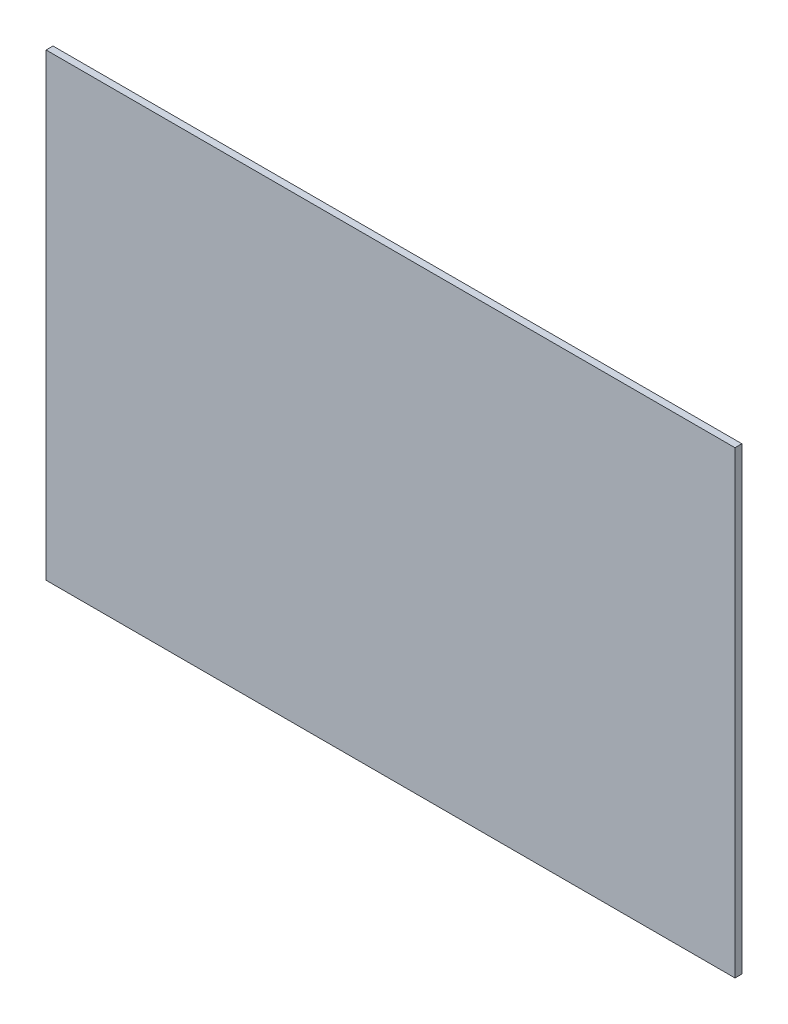
ISO-10303-21;
HEADER;
FILE_DESCRIPTION(('STEP AP214'),'2;1');
FILE_NAME('part.step','',(''),(''),'','','');
FILE_SCHEMA(('AUTOMOTIVE_DESIGN { 1 0 10303 214 1 1 1 1 }'));
ENDSEC;
DATA;
#1=APPLICATION_CONTEXT('core data for automotive mechanical design processes');
#2=APPLICATION_PROTOCOL_DEFINITION('international standard','automotive_design',2000,#1);
#3=PRODUCT_CONTEXT('',#1,'mechanical');
#4=PRODUCT('Part','Part','',(#3));
#5=PRODUCT_RELATED_PRODUCT_CATEGORY('part','',(#4));
#6=PRODUCT_DEFINITION_FORMATION('','',#4);
#7=PRODUCT_DEFINITION_CONTEXT('part definition',#1,'design');
#8=PRODUCT_DEFINITION('design','',#6,#7);
#9=PRODUCT_DEFINITION_SHAPE('','',#8);
#10=(LENGTH_UNIT() NAMED_UNIT(*) SI_UNIT(.MILLI.,.METRE.));
#11=(NAMED_UNIT(*) PLANE_ANGLE_UNIT() SI_UNIT($,.RADIAN.));
#12=(NAMED_UNIT(*) SI_UNIT($,.STERADIAN.) SOLID_ANGLE_UNIT());
#13=UNCERTAINTY_MEASURE_WITH_UNIT(LENGTH_MEASURE(1.E-05),#10,'distance_accuracy_value','');
#14=(GEOMETRIC_REPRESENTATION_CONTEXT(3) GLOBAL_UNCERTAINTY_ASSIGNED_CONTEXT((#13)) GLOBAL_UNIT_ASSIGNED_CONTEXT((#10,
#11,#12)) REPRESENTATION_CONTEXT('',''));
#15=CARTESIAN_POINT('',(0.,0.,0.));
#16=DIRECTION('',(0.,0.,1.));
#17=DIRECTION('',(1.,0.,0.));
#18=AXIS2_PLACEMENT_3D('',#15,#16,#17);
#19=CARTESIAN_POINT('',(-150.,-100.,3.));
#20=DIRECTION('',(1.,0.,0.));
#21=DIRECTION('',(0.,0.,-1.));
#22=AXIS2_PLACEMENT_3D('',#19,#20,#21);
#23=PLANE('',#22);
#24=DIRECTION('',(0.,-1.,0.));
#25=VECTOR('',#24,1.);
#26=CARTESIAN_POINT('',(-150.,-100.,0.));
#27=LINE('',#26,#25);
#28=CARTESIAN_POINT('',(-150.,100.,0.));
#29=VERTEX_POINT('',#28);
#30=CARTESIAN_POINT('',(-150.,-100.,0.));
#31=VERTEX_POINT('',#30);
#32=EDGE_CURVE('E102',#29,#31,#27,.T.);
#33=ORIENTED_EDGE('',*,*,#32,.T.);
#34=DIRECTION('',(0.,0.,-1.));
#35=VECTOR('',#34,1.);
#36=CARTESIAN_POINT('',(-150.,-100.,3.));
#37=LINE('',#36,#35);
#38=CARTESIAN_POINT('',(-150.,-100.,3.));
#39=VERTEX_POINT('',#38);
#40=EDGE_CURVE('E11',#39,#31,#37,.T.);
#41=ORIENTED_EDGE('',*,*,#40,.F.);
#42=DIRECTION('',(0.,-1.,0.));
#43=VECTOR('',#42,1.);
#44=CARTESIAN_POINT('',(-150.,-100.,3.));
#45=LINE('',#44,#43);
#46=CARTESIAN_POINT('',(-150.,100.,3.));
#47=VERTEX_POINT('',#46);
#48=EDGE_CURVE('E90',#47,#39,#45,.T.);
#49=ORIENTED_EDGE('',*,*,#48,.F.);
#50=DIRECTION('',(0.,0.,-1.));
#51=VECTOR('',#50,1.);
#52=CARTESIAN_POINT('',(-150.,100.,3.));
#53=LINE('',#52,#51);
#54=EDGE_CURVE('E98',#47,#29,#53,.T.);
#55=ORIENTED_EDGE('',*,*,#54,.T.);
#56=EDGE_LOOP('',(#33,#41,#49,#55));
#57=FACE_BOUND('',#56,.T.);
#58=ADVANCED_FACE('F39',(#57),#23,.F.);
#59=CARTESIAN_POINT('',(-150.,-100.,3.));
#60=DIRECTION('',(0.,1.,0.));
#61=DIRECTION('',(0.,0.,1.));
#62=AXIS2_PLACEMENT_3D('',#59,#60,#61);
#63=PLANE('',#62);
#64=DIRECTION('',(1.,0.,0.));
#65=VECTOR('',#64,1.);
#66=CARTESIAN_POINT('',(-150.,-100.,0.));
#67=LINE('',#66,#65);
#68=CARTESIAN_POINT('',(150.,-100.,0.));
#69=VERTEX_POINT('',#68);
#70=EDGE_CURVE('E94',#31,#69,#67,.T.);
#71=ORIENTED_EDGE('',*,*,#70,.T.);
#72=DIRECTION('',(0.,0.,-1.));
#73=VECTOR('',#72,1.);
#74=CARTESIAN_POINT('',(150.,-100.,3.));
#75=LINE('',#74,#73);
#76=CARTESIAN_POINT('',(150.,-100.,3.));
#77=VERTEX_POINT('',#76);
#78=EDGE_CURVE('E47',#77,#69,#75,.T.);
#79=ORIENTED_EDGE('',*,*,#78,.F.);
#80=DIRECTION('',(1.,0.,0.));
#81=VECTOR('',#80,1.);
#82=CARTESIAN_POINT('',(-150.,-100.,3.));
#83=LINE('',#82,#81);
#84=EDGE_CURVE('E85',#39,#77,#83,.T.);
#85=ORIENTED_EDGE('',*,*,#84,.F.);
#86=ORIENTED_EDGE('',*,*,#40,.T.);
#87=EDGE_LOOP('',(#71,#79,#85,#86));
#88=FACE_BOUND('',#87,.T.);
#89=ADVANCED_FACE('F93',(#88),#63,.F.);
#90=CARTESIAN_POINT('',(150.,-100.,3.));
#91=DIRECTION('',(-1.,0.,0.));
#92=DIRECTION('',(0.,0.,1.));
#93=AXIS2_PLACEMENT_3D('',#90,#91,#92);
#94=PLANE('',#93);
#95=DIRECTION('',(0.,1.,0.));
#96=VECTOR('',#95,1.);
#97=CARTESIAN_POINT('',(150.,-100.,0.));
#98=LINE('',#97,#96);
#99=CARTESIAN_POINT('',(150.,100.,0.));
#100=VERTEX_POINT('',#99);
#101=EDGE_CURVE('E72',#69,#100,#98,.T.);
#102=ORIENTED_EDGE('',*,*,#101,.T.);
#103=DIRECTION('',(0.,0.,-1.));
#104=VECTOR('',#103,1.);
#105=CARTESIAN_POINT('',(150.,100.,3.));
#106=LINE('',#105,#104);
#107=CARTESIAN_POINT('',(150.,100.,3.));
#108=VERTEX_POINT('',#107);
#109=EDGE_CURVE('E95',#108,#100,#106,.T.);
#110=ORIENTED_EDGE('',*,*,#109,.F.);
#111=DIRECTION('',(0.,1.,0.));
#112=VECTOR('',#111,1.);
#113=CARTESIAN_POINT('',(150.,-100.,3.));
#114=LINE('',#113,#112);
#115=EDGE_CURVE('E88',#77,#108,#114,.T.);
#116=ORIENTED_EDGE('',*,*,#115,.F.);
#117=ORIENTED_EDGE('',*,*,#78,.T.);
#118=EDGE_LOOP('',(#102,#110,#116,#117));
#119=FACE_BOUND('',#118,.T.);
#120=ADVANCED_FACE('F96',(#119),#94,.F.);
#121=CARTESIAN_POINT('',(-150.,100.,3.));
#122=DIRECTION('',(0.,-1.,0.));
#123=DIRECTION('',(0.,0.,-1.));
#124=AXIS2_PLACEMENT_3D('',#121,#122,#123);
#125=PLANE('',#124);
#126=DIRECTION('',(-1.,0.,0.));
#127=VECTOR('',#126,1.);
#128=CARTESIAN_POINT('',(-150.,100.,0.));
#129=LINE('',#128,#127);
#130=EDGE_CURVE('E78',#100,#29,#129,.T.);
#131=ORIENTED_EDGE('',*,*,#130,.T.);
#132=ORIENTED_EDGE('',*,*,#54,.F.);
#133=DIRECTION('',(-1.,0.,0.));
#134=VECTOR('',#133,1.);
#135=CARTESIAN_POINT('',(-150.,100.,3.));
#136=LINE('',#135,#134);
#137=EDGE_CURVE('E55',#108,#47,#136,.T.);
#138=ORIENTED_EDGE('',*,*,#137,.F.);
#139=ORIENTED_EDGE('',*,*,#109,.T.);
#140=EDGE_LOOP('',(#131,#132,#138,#139));
#141=FACE_BOUND('',#140,.T.);
#142=ADVANCED_FACE('F109',(#141),#125,.F.);
#143=CARTESIAN_POINT('',(0.,0.,3.));
#144=DIRECTION('',(0.,0.,-1.));
#145=DIRECTION('',(-1.,0.,0.));
#146=AXIS2_PLACEMENT_3D('',#143,#144,#145);
#147=PLANE('',#146);
#148=ORIENTED_EDGE('',*,*,#48,.T.);
#149=ORIENTED_EDGE('',*,*,#84,.T.);
#150=ORIENTED_EDGE('',*,*,#115,.T.);
#151=ORIENTED_EDGE('',*,*,#137,.T.);
#152=EDGE_LOOP('',(#148,#149,#150,#151));
#153=FACE_BOUND('',#152,.T.);
#154=ADVANCED_FACE('F86',(#153),#147,.F.);
#155=CARTESIAN_POINT('',(0.,0.,0.));
#156=DIRECTION('',(0.,0.,-1.));
#157=DIRECTION('',(-1.,0.,0.));
#158=AXIS2_PLACEMENT_3D('',#155,#156,#157);
#159=PLANE('',#158);
#160=ORIENTED_EDGE('',*,*,#32,.F.);
#161=ORIENTED_EDGE('',*,*,#130,.F.);
#162=ORIENTED_EDGE('',*,*,#101,.F.);
#163=ORIENTED_EDGE('',*,*,#70,.F.);
#164=EDGE_LOOP('',(#160,#161,#162,#163));
#165=FACE_BOUND('',#164,.T.);
#166=ADVANCED_FACE('F112',(#165),#159,.T.);
#167=CLOSED_SHELL('',(#58,#89,#120,#142,#154,#166));
#168=MANIFOLD_SOLID_BREP('B2',#167);
#169=ADVANCED_BREP_SHAPE_REPRESENTATION('',(#18,#168),#14);
#170=SHAPE_DEFINITION_REPRESENTATION(#9,#169);
ENDSEC;
END-ISO-10303-21;
